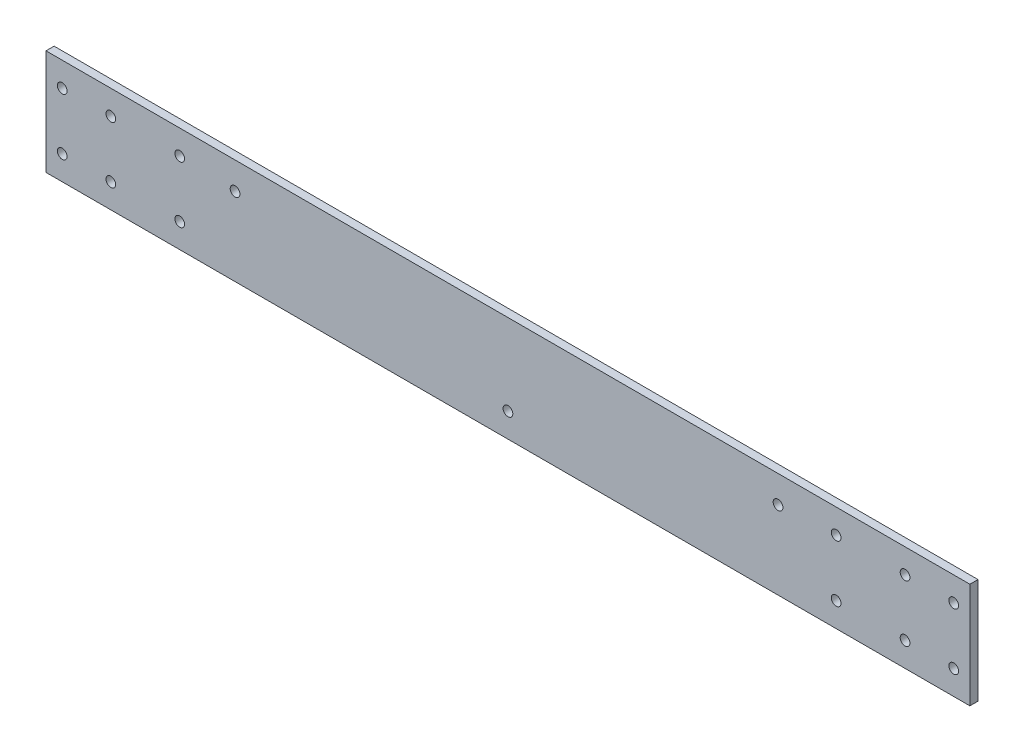
ISO-10303-21;
HEADER;
FILE_DESCRIPTION(('STEP AP214'),'2;1');
FILE_NAME('part.step','',(''),(''),'','','');
FILE_SCHEMA(('AUTOMOTIVE_DESIGN { 1 0 10303 214 1 1 1 1 }'));
ENDSEC;
DATA;
#1=APPLICATION_CONTEXT('core data for automotive mechanical design processes');
#2=APPLICATION_PROTOCOL_DEFINITION('international standard','automotive_design',2000,#1);
#3=PRODUCT_CONTEXT('',#1,'mechanical');
#4=PRODUCT('Part','Part','',(#3));
#5=PRODUCT_RELATED_PRODUCT_CATEGORY('part','',(#4));
#6=PRODUCT_DEFINITION_FORMATION('','',#4);
#7=PRODUCT_DEFINITION_CONTEXT('part definition',#1,'design');
#8=PRODUCT_DEFINITION('design','',#6,#7);
#9=PRODUCT_DEFINITION_SHAPE('','',#8);
#10=(LENGTH_UNIT() NAMED_UNIT(*) SI_UNIT(.MILLI.,.METRE.));
#11=(NAMED_UNIT(*) PLANE_ANGLE_UNIT() SI_UNIT($,.RADIAN.));
#12=(NAMED_UNIT(*) SI_UNIT($,.STERADIAN.) SOLID_ANGLE_UNIT());
#13=UNCERTAINTY_MEASURE_WITH_UNIT(LENGTH_MEASURE(1.E-05),#10,'distance_accuracy_value','');
#14=(GEOMETRIC_REPRESENTATION_CONTEXT(3) GLOBAL_UNCERTAINTY_ASSIGNED_CONTEXT((#13)) GLOBAL_UNIT_ASSIGNED_CONTEXT((#10,
#11,#12)) REPRESENTATION_CONTEXT('',''));
#15=CARTESIAN_POINT('',(0.,0.,0.));
#16=DIRECTION('',(0.,0.,1.));
#17=DIRECTION('',(1.,0.,0.));
#18=AXIS2_PLACEMENT_3D('',#15,#16,#17);
#19=CARTESIAN_POINT('',(0.,0.,10.));
#20=DIRECTION('',(0.,0.,1.));
#21=DIRECTION('',(1.,0.,0.));
#22=AXIS2_PLACEMENT_3D('',#19,#20,#21);
#23=PLANE('',#22);
#24=CARTESIAN_POINT('',(-336.722006644744,31.4673024219252,10.));
#25=DIRECTION('',(0.,0.,1.));
#26=DIRECTION('',(1.,0.,0.));
#27=AXIS2_PLACEMENT_3D('',#24,#25,#26);
#28=CIRCLE('',#27,5.99999999999999);
#29=CARTESIAN_POINT('',(-330.722006644744,31.4673024219252,10.));
#30=VERTEX_POINT('',#29);
#31=EDGE_CURVE('E201',#30,#30,#28,.T.);
#32=ORIENTED_EDGE('',*,*,#31,.F.);
#33=EDGE_LOOP('',(#32));
#34=FACE_BOUND('',#33,.T.);
#35=CARTESIAN_POINT('',(333.277993355256,31.4673024219252,10.));
#36=DIRECTION('',(0.,0.,1.));
#37=DIRECTION('',(1.,0.,0.));
#38=AXIS2_PLACEMENT_3D('',#35,#36,#37);
#39=CIRCLE('',#38,5.99999999999999);
#40=CARTESIAN_POINT('',(339.277993355256,31.4673024219252,10.));
#41=VERTEX_POINT('',#40);
#42=EDGE_CURVE('E195',#41,#41,#39,.T.);
#43=ORIENTED_EDGE('',*,*,#42,.F.);
#44=EDGE_LOOP('',(#43));
#45=FACE_BOUND('',#44,.T.);
#46=CARTESIAN_POINT('',(8.96227536628658E-12,-35.0000000000066,10.));
#47=DIRECTION('',(0.,0.,1.));
#48=DIRECTION('',(1.,0.,0.));
#49=AXIS2_PLACEMENT_3D('',#46,#47,#48);
#50=CIRCLE('',#49,6.);
#51=CARTESIAN_POINT('',(6.00000000000896,-35.0000000000066,10.));
#52=VERTEX_POINT('',#51);
#53=EDGE_CURVE('E189',#52,#52,#50,.T.);
#54=ORIENTED_EDGE('',*,*,#53,.F.);
#55=EDGE_LOOP('',(#54));
#56=FACE_BOUND('',#55,.T.);
#57=CARTESIAN_POINT('',(490.,35.0000000000001,10.));
#58=DIRECTION('',(0.,0.,1.));
#59=DIRECTION('',(-1.,0.,0.));
#60=AXIS2_PLACEMENT_3D('',#57,#58,#59);
#61=CIRCLE('',#60,5.99999999999999);
#62=CARTESIAN_POINT('',(484.,35.0000000000001,10.));
#63=VERTEX_POINT('',#62);
#64=EDGE_CURVE('E174',#63,#63,#61,.T.);
#65=ORIENTED_EDGE('',*,*,#64,.F.);
#66=EDGE_LOOP('',(#65));
#67=FACE_BOUND('',#66,.T.);
#68=CARTESIAN_POINT('',(550.,-34.9999999999999,10.));
#69=DIRECTION('',(0.,0.,1.));
#70=DIRECTION('',(-1.,0.,0.));
#71=AXIS2_PLACEMENT_3D('',#68,#69,#70);
#72=CIRCLE('',#71,5.99999999999999);
#73=CARTESIAN_POINT('',(544.,-34.9999999999999,10.));
#74=VERTEX_POINT('',#73);
#75=EDGE_CURVE('E162',#74,#74,#72,.T.);
#76=ORIENTED_EDGE('',*,*,#75,.F.);
#77=EDGE_LOOP('',(#76));
#78=FACE_BOUND('',#77,.T.);
#79=CARTESIAN_POINT('',(405.,-35.,10.));
#80=DIRECTION('',(0.,0.,1.));
#81=DIRECTION('',(-1.,0.,0.));
#82=AXIS2_PLACEMENT_3D('',#79,#80,#81);
#83=CIRCLE('',#82,6.00000000000005);
#84=CARTESIAN_POINT('',(399.,-35.,10.));
#85=VERTEX_POINT('',#84);
#86=EDGE_CURVE('E150',#85,#85,#83,.T.);
#87=ORIENTED_EDGE('',*,*,#86,.F.);
#88=EDGE_LOOP('',(#87));
#89=FACE_BOUND('',#88,.T.);
#90=CARTESIAN_POINT('',(-490.,-35.0000000000001,10.));
#91=DIRECTION('',(0.,0.,1.));
#92=DIRECTION('',(1.,0.,0.));
#93=AXIS2_PLACEMENT_3D('',#90,#91,#92);
#94=CIRCLE('',#93,5.99999999999999);
#95=CARTESIAN_POINT('',(-484.,-35.0000000000001,10.));
#96=VERTEX_POINT('',#95);
#97=EDGE_CURVE('E138',#96,#96,#94,.T.);
#98=ORIENTED_EDGE('',*,*,#97,.F.);
#99=EDGE_LOOP('',(#98));
#100=FACE_BOUND('',#99,.T.);
#101=CARTESIAN_POINT('',(-405.,35.,10.));
#102=DIRECTION('',(0.,0.,1.));
#103=DIRECTION('',(1.,0.,0.));
#104=AXIS2_PLACEMENT_3D('',#101,#102,#103);
#105=CIRCLE('',#104,5.99999999999999);
#106=CARTESIAN_POINT('',(-399.,35.,10.));
#107=VERTEX_POINT('',#106);
#108=EDGE_CURVE('E126',#107,#107,#105,.T.);
#109=ORIENTED_EDGE('',*,*,#108,.F.);
#110=EDGE_LOOP('',(#109));
#111=FACE_BOUND('',#110,.T.);
#112=CARTESIAN_POINT('',(-550.,35.,10.));
#113=DIRECTION('',(0.,0.,1.));
#114=DIRECTION('',(1.,0.,0.));
#115=AXIS2_PLACEMENT_3D('',#112,#113,#114);
#116=CIRCLE('',#115,5.99999999999999);
#117=CARTESIAN_POINT('',(-544.,35.,10.));
#118=VERTEX_POINT('',#117);
#119=EDGE_CURVE('E105',#118,#118,#116,.T.);
#120=ORIENTED_EDGE('',*,*,#119,.F.);
#121=EDGE_LOOP('',(#120));
#122=FACE_BOUND('',#121,.T.);
#123=DIRECTION('',(0.,-1.,0.));
#124=VECTOR('',#123,1.);
#125=CARTESIAN_POINT('',(-570.,64.9999999999999,10.));
#126=LINE('',#125,#124);
#127=CARTESIAN_POINT('',(-570.,64.9999999999999,10.));
#128=VERTEX_POINT('',#127);
#129=CARTESIAN_POINT('',(-570.,-65.0000000000001,10.));
#130=VERTEX_POINT('',#129);
#131=EDGE_CURVE('E90',#128,#130,#126,.T.);
#132=ORIENTED_EDGE('',*,*,#131,.T.);
#133=DIRECTION('',(1.,0.,0.));
#134=VECTOR('',#133,1.);
#135=CARTESIAN_POINT('',(-570.,-65.0000000000001,10.));
#136=LINE('',#135,#134);
#137=CARTESIAN_POINT('',(570.,-65.,10.));
#138=VERTEX_POINT('',#137);
#139=EDGE_CURVE('E85',#130,#138,#136,.T.);
#140=ORIENTED_EDGE('',*,*,#139,.T.);
#141=DIRECTION('',(0.,1.,0.));
#142=VECTOR('',#141,1.);
#143=CARTESIAN_POINT('',(570.,65.,10.));
#144=LINE('',#143,#142);
#145=CARTESIAN_POINT('',(570.,65.,10.));
#146=VERTEX_POINT('',#145);
#147=EDGE_CURVE('E88',#138,#146,#144,.T.);
#148=ORIENTED_EDGE('',*,*,#147,.T.);
#149=DIRECTION('',(-1.,0.,0.));
#150=VECTOR('',#149,1.);
#151=CARTESIAN_POINT('',(-570.,64.9999999999999,10.));
#152=LINE('',#151,#150);
#153=EDGE_CURVE('E55',#146,#128,#152,.T.);
#154=ORIENTED_EDGE('',*,*,#153,.T.);
#155=EDGE_LOOP('',(#132,#140,#148,#154));
#156=FACE_BOUND('',#155,.T.);
#157=CARTESIAN_POINT('',(-490.,35.,10.));
#158=DIRECTION('',(0.,0.,1.));
#159=DIRECTION('',(1.,0.,0.));
#160=AXIS2_PLACEMENT_3D('',#157,#158,#159);
#161=CIRCLE('',#160,5.99999999999999);
#162=CARTESIAN_POINT('',(-484.,35.,10.));
#163=VERTEX_POINT('',#162);
#164=EDGE_CURVE('E120',#163,#163,#161,.T.);
#165=ORIENTED_EDGE('',*,*,#164,.F.);
#166=EDGE_LOOP('',(#165));
#167=FACE_BOUND('',#166,.T.);
#168=CARTESIAN_POINT('',(-550.,-35.0000000000001,10.));
#169=DIRECTION('',(0.,0.,1.));
#170=DIRECTION('',(1.,0.,0.));
#171=AXIS2_PLACEMENT_3D('',#168,#169,#170);
#172=CIRCLE('',#171,5.99999999999999);
#173=CARTESIAN_POINT('',(-544.,-35.0000000000001,10.));
#174=VERTEX_POINT('',#173);
#175=EDGE_CURVE('E132',#174,#174,#172,.T.);
#176=ORIENTED_EDGE('',*,*,#175,.F.);
#177=EDGE_LOOP('',(#176));
#178=FACE_BOUND('',#177,.T.);
#179=CARTESIAN_POINT('',(-405.,-35.0000000000001,10.));
#180=DIRECTION('',(0.,0.,1.));
#181=DIRECTION('',(1.,0.,0.));
#182=AXIS2_PLACEMENT_3D('',#179,#180,#181);
#183=CIRCLE('',#182,5.99999999999999);
#184=CARTESIAN_POINT('',(-399.,-35.0000000000001,10.));
#185=VERTEX_POINT('',#184);
#186=EDGE_CURVE('E144',#185,#185,#183,.T.);
#187=ORIENTED_EDGE('',*,*,#186,.F.);
#188=EDGE_LOOP('',(#187));
#189=FACE_BOUND('',#188,.T.);
#190=CARTESIAN_POINT('',(490.,-34.9999999999999,10.));
#191=DIRECTION('',(0.,0.,1.));
#192=DIRECTION('',(-1.,0.,0.));
#193=AXIS2_PLACEMENT_3D('',#190,#191,#192);
#194=CIRCLE('',#193,5.99999999999999);
#195=CARTESIAN_POINT('',(484.,-34.9999999999999,10.));
#196=VERTEX_POINT('',#195);
#197=EDGE_CURVE('E156',#196,#196,#194,.T.);
#198=ORIENTED_EDGE('',*,*,#197,.F.);
#199=EDGE_LOOP('',(#198));
#200=FACE_BOUND('',#199,.T.);
#201=CARTESIAN_POINT('',(405.,35.,10.));
#202=DIRECTION('',(0.,0.,1.));
#203=DIRECTION('',(-1.,0.,0.));
#204=AXIS2_PLACEMENT_3D('',#201,#202,#203);
#205=CIRCLE('',#204,6.00000000000005);
#206=CARTESIAN_POINT('',(399.,35.,10.));
#207=VERTEX_POINT('',#206);
#208=EDGE_CURVE('E168',#207,#207,#205,.T.);
#209=ORIENTED_EDGE('',*,*,#208,.F.);
#210=EDGE_LOOP('',(#209));
#211=FACE_BOUND('',#210,.T.);
#212=CARTESIAN_POINT('',(550.,35.0000000000001,10.));
#213=DIRECTION('',(0.,0.,1.));
#214=DIRECTION('',(-1.,0.,0.));
#215=AXIS2_PLACEMENT_3D('',#212,#213,#214);
#216=CIRCLE('',#215,5.99999999999999);
#217=CARTESIAN_POINT('',(544.,35.0000000000001,10.));
#218=VERTEX_POINT('',#217);
#219=EDGE_CURVE('E180',#218,#218,#216,.T.);
#220=ORIENTED_EDGE('',*,*,#219,.F.);
#221=EDGE_LOOP('',(#220));
#222=FACE_BOUND('',#221,.T.);
#223=ADVANCED_FACE('F38',(#34,#45,#56,#67,#78,#89,#100,#111,#122,#156,#167,#178,#189,#200,#211,
#222),#23,.T.);
#224=CARTESIAN_POINT('',(0.,0.,0.));
#225=DIRECTION('',(0.,0.,1.));
#226=DIRECTION('',(1.,0.,0.));
#227=AXIS2_PLACEMENT_3D('',#224,#225,#226);
#228=PLANE('',#227);
#229=CARTESIAN_POINT('',(-336.722006644744,31.4673024219252,0.));
#230=DIRECTION('',(0.,0.,1.));
#231=DIRECTION('',(1.,0.,0.));
#232=AXIS2_PLACEMENT_3D('',#229,#230,#231);
#233=CIRCLE('',#232,5.99999999999999);
#234=CARTESIAN_POINT('',(-330.722006644744,31.4673024219252,0.));
#235=VERTEX_POINT('',#234);
#236=EDGE_CURVE('E198',#235,#235,#233,.T.);
#237=ORIENTED_EDGE('',*,*,#236,.T.);
#238=EDGE_LOOP('',(#237));
#239=FACE_BOUND('',#238,.T.);
#240=CARTESIAN_POINT('',(333.277993355256,31.4673024219252,0.));
#241=DIRECTION('',(0.,0.,1.));
#242=DIRECTION('',(1.,0.,0.));
#243=AXIS2_PLACEMENT_3D('',#240,#241,#242);
#244=CIRCLE('',#243,5.99999999999999);
#245=CARTESIAN_POINT('',(339.277993355256,31.4673024219252,0.));
#246=VERTEX_POINT('',#245);
#247=EDGE_CURVE('E192',#246,#246,#244,.T.);
#248=ORIENTED_EDGE('',*,*,#247,.T.);
#249=EDGE_LOOP('',(#248));
#250=FACE_BOUND('',#249,.T.);
#251=CARTESIAN_POINT('',(8.96227536628658E-12,-35.0000000000066,0.));
#252=DIRECTION('',(0.,0.,1.));
#253=DIRECTION('',(1.,0.,0.));
#254=AXIS2_PLACEMENT_3D('',#251,#252,#253);
#255=CIRCLE('',#254,6.);
#256=CARTESIAN_POINT('',(6.00000000000896,-35.0000000000066,0.));
#257=VERTEX_POINT('',#256);
#258=EDGE_CURVE('E186',#257,#257,#255,.T.);
#259=ORIENTED_EDGE('',*,*,#258,.T.);
#260=EDGE_LOOP('',(#259));
#261=FACE_BOUND('',#260,.T.);
#262=CARTESIAN_POINT('',(490.,35.0000000000001,0.));
#263=DIRECTION('',(0.,0.,1.));
#264=DIRECTION('',(-1.,0.,0.));
#265=AXIS2_PLACEMENT_3D('',#262,#263,#264);
#266=CIRCLE('',#265,5.99999999999999);
#267=CARTESIAN_POINT('',(484.,35.0000000000001,0.));
#268=VERTEX_POINT('',#267);
#269=EDGE_CURVE('E177',#268,#268,#266,.T.);
#270=ORIENTED_EDGE('',*,*,#269,.T.);
#271=EDGE_LOOP('',(#270));
#272=FACE_BOUND('',#271,.T.);
#273=CARTESIAN_POINT('',(550.,-34.9999999999999,0.));
#274=DIRECTION('',(0.,0.,1.));
#275=DIRECTION('',(-1.,0.,0.));
#276=AXIS2_PLACEMENT_3D('',#273,#274,#275);
#277=CIRCLE('',#276,5.99999999999999);
#278=CARTESIAN_POINT('',(544.,-34.9999999999999,0.));
#279=VERTEX_POINT('',#278);
#280=EDGE_CURVE('E165',#279,#279,#277,.T.);
#281=ORIENTED_EDGE('',*,*,#280,.T.);
#282=EDGE_LOOP('',(#281));
#283=FACE_BOUND('',#282,.T.);
#284=CARTESIAN_POINT('',(405.,-35.,0.));
#285=DIRECTION('',(0.,0.,1.));
#286=DIRECTION('',(-1.,0.,0.));
#287=AXIS2_PLACEMENT_3D('',#284,#285,#286);
#288=CIRCLE('',#287,6.00000000000005);
#289=CARTESIAN_POINT('',(399.,-35.,0.));
#290=VERTEX_POINT('',#289);
#291=EDGE_CURVE('E153',#290,#290,#288,.T.);
#292=ORIENTED_EDGE('',*,*,#291,.T.);
#293=EDGE_LOOP('',(#292));
#294=FACE_BOUND('',#293,.T.);
#295=CARTESIAN_POINT('',(-490.,-35.0000000000001,0.));
#296=DIRECTION('',(0.,0.,1.));
#297=DIRECTION('',(1.,0.,0.));
#298=AXIS2_PLACEMENT_3D('',#295,#296,#297);
#299=CIRCLE('',#298,5.99999999999999);
#300=CARTESIAN_POINT('',(-484.,-35.0000000000001,0.));
#301=VERTEX_POINT('',#300);
#302=EDGE_CURVE('E141',#301,#301,#299,.T.);
#303=ORIENTED_EDGE('',*,*,#302,.T.);
#304=EDGE_LOOP('',(#303));
#305=FACE_BOUND('',#304,.T.);
#306=CARTESIAN_POINT('',(-405.,35.,0.));
#307=DIRECTION('',(0.,0.,1.));
#308=DIRECTION('',(1.,0.,0.));
#309=AXIS2_PLACEMENT_3D('',#306,#307,#308);
#310=CIRCLE('',#309,5.99999999999999);
#311=CARTESIAN_POINT('',(-399.,35.,0.));
#312=VERTEX_POINT('',#311);
#313=EDGE_CURVE('E129',#312,#312,#310,.T.);
#314=ORIENTED_EDGE('',*,*,#313,.T.);
#315=EDGE_LOOP('',(#314));
#316=FACE_BOUND('',#315,.T.);
#317=CARTESIAN_POINT('',(-550.,35.,0.));
#318=DIRECTION('',(0.,0.,1.));
#319=DIRECTION('',(1.,0.,0.));
#320=AXIS2_PLACEMENT_3D('',#317,#318,#319);
#321=CIRCLE('',#320,5.99999999999999);
#322=CARTESIAN_POINT('',(-544.,35.,0.));
#323=VERTEX_POINT('',#322);
#324=EDGE_CURVE('E117',#323,#323,#321,.T.);
#325=ORIENTED_EDGE('',*,*,#324,.T.);
#326=EDGE_LOOP('',(#325));
#327=FACE_BOUND('',#326,.T.);
#328=DIRECTION('',(0.,-1.,0.));
#329=VECTOR('',#328,1.);
#330=CARTESIAN_POINT('',(-570.,64.9999999999999,0.));
#331=LINE('',#330,#329);
#332=CARTESIAN_POINT('',(-570.,64.9999999999999,0.));
#333=VERTEX_POINT('',#332);
#334=CARTESIAN_POINT('',(-570.,-65.0000000000001,0.));
#335=VERTEX_POINT('',#334);
#336=EDGE_CURVE('E102',#333,#335,#331,.T.);
#337=ORIENTED_EDGE('',*,*,#336,.F.);
#338=DIRECTION('',(-1.,0.,0.));
#339=VECTOR('',#338,1.);
#340=CARTESIAN_POINT('',(-570.,64.9999999999999,0.));
#341=LINE('',#340,#339);
#342=CARTESIAN_POINT('',(570.,65.,0.));
#343=VERTEX_POINT('',#342);
#344=EDGE_CURVE('E78',#343,#333,#341,.T.);
#345=ORIENTED_EDGE('',*,*,#344,.F.);
#346=DIRECTION('',(0.,1.,0.));
#347=VECTOR('',#346,1.);
#348=CARTESIAN_POINT('',(570.,65.,0.));
#349=LINE('',#348,#347);
#350=CARTESIAN_POINT('',(570.,-65.,0.));
#351=VERTEX_POINT('',#350);
#352=EDGE_CURVE('E72',#351,#343,#349,.T.);
#353=ORIENTED_EDGE('',*,*,#352,.F.);
#354=DIRECTION('',(1.,0.,0.));
#355=VECTOR('',#354,1.);
#356=CARTESIAN_POINT('',(-570.,-65.0000000000001,0.));
#357=LINE('',#356,#355);
#358=EDGE_CURVE('E94',#335,#351,#357,.T.);
#359=ORIENTED_EDGE('',*,*,#358,.F.);
#360=EDGE_LOOP('',(#337,#345,#353,#359));
#361=FACE_BOUND('',#360,.T.);
#362=CARTESIAN_POINT('',(-490.,35.,0.));
#363=DIRECTION('',(0.,0.,1.));
#364=DIRECTION('',(1.,0.,0.));
#365=AXIS2_PLACEMENT_3D('',#362,#363,#364);
#366=CIRCLE('',#365,5.99999999999999);
#367=CARTESIAN_POINT('',(-484.,35.,0.));
#368=VERTEX_POINT('',#367);
#369=EDGE_CURVE('E123',#368,#368,#366,.T.);
#370=ORIENTED_EDGE('',*,*,#369,.T.);
#371=EDGE_LOOP('',(#370));
#372=FACE_BOUND('',#371,.T.);
#373=CARTESIAN_POINT('',(-550.,-35.0000000000001,0.));
#374=DIRECTION('',(0.,0.,1.));
#375=DIRECTION('',(1.,0.,0.));
#376=AXIS2_PLACEMENT_3D('',#373,#374,#375);
#377=CIRCLE('',#376,5.99999999999999);
#378=CARTESIAN_POINT('',(-544.,-35.0000000000001,0.));
#379=VERTEX_POINT('',#378);
#380=EDGE_CURVE('E135',#379,#379,#377,.T.);
#381=ORIENTED_EDGE('',*,*,#380,.T.);
#382=EDGE_LOOP('',(#381));
#383=FACE_BOUND('',#382,.T.);
#384=CARTESIAN_POINT('',(-405.,-35.0000000000001,0.));
#385=DIRECTION('',(0.,0.,1.));
#386=DIRECTION('',(1.,0.,0.));
#387=AXIS2_PLACEMENT_3D('',#384,#385,#386);
#388=CIRCLE('',#387,5.99999999999999);
#389=CARTESIAN_POINT('',(-399.,-35.0000000000001,0.));
#390=VERTEX_POINT('',#389);
#391=EDGE_CURVE('E147',#390,#390,#388,.T.);
#392=ORIENTED_EDGE('',*,*,#391,.T.);
#393=EDGE_LOOP('',(#392));
#394=FACE_BOUND('',#393,.T.);
#395=CARTESIAN_POINT('',(490.,-34.9999999999999,0.));
#396=DIRECTION('',(0.,0.,1.));
#397=DIRECTION('',(-1.,0.,0.));
#398=AXIS2_PLACEMENT_3D('',#395,#396,#397);
#399=CIRCLE('',#398,5.99999999999999);
#400=CARTESIAN_POINT('',(484.,-34.9999999999999,0.));
#401=VERTEX_POINT('',#400);
#402=EDGE_CURVE('E159',#401,#401,#399,.T.);
#403=ORIENTED_EDGE('',*,*,#402,.T.);
#404=EDGE_LOOP('',(#403));
#405=FACE_BOUND('',#404,.T.);
#406=CARTESIAN_POINT('',(405.,35.,0.));
#407=DIRECTION('',(0.,0.,1.));
#408=DIRECTION('',(-1.,0.,0.));
#409=AXIS2_PLACEMENT_3D('',#406,#407,#408);
#410=CIRCLE('',#409,6.00000000000005);
#411=CARTESIAN_POINT('',(399.,35.,0.));
#412=VERTEX_POINT('',#411);
#413=EDGE_CURVE('E171',#412,#412,#410,.T.);
#414=ORIENTED_EDGE('',*,*,#413,.T.);
#415=EDGE_LOOP('',(#414));
#416=FACE_BOUND('',#415,.T.);
#417=CARTESIAN_POINT('',(550.,35.0000000000001,0.));
#418=DIRECTION('',(0.,0.,1.));
#419=DIRECTION('',(-1.,0.,0.));
#420=AXIS2_PLACEMENT_3D('',#417,#418,#419);
#421=CIRCLE('',#420,5.99999999999999);
#422=CARTESIAN_POINT('',(544.,35.0000000000001,0.));
#423=VERTEX_POINT('',#422);
#424=EDGE_CURVE('E183',#423,#423,#421,.T.);
#425=ORIENTED_EDGE('',*,*,#424,.T.);
#426=EDGE_LOOP('',(#425));
#427=FACE_BOUND('',#426,.T.);
#428=ADVANCED_FACE('F113',(#239,#250,#261,#272,#283,#294,#305,#316,#327,#361,#372,#383,#394,
#405,#416,#427),#228,.F.);
#429=CARTESIAN_POINT('',(-570.,64.9999999999999,10.));
#430=DIRECTION('',(1.,0.,0.));
#431=DIRECTION('',(0.,0.,-1.));
#432=AXIS2_PLACEMENT_3D('',#429,#430,#431);
#433=PLANE('',#432);
#434=ORIENTED_EDGE('',*,*,#336,.T.);
#435=DIRECTION('',(0.,0.,-1.));
#436=VECTOR('',#435,1.);
#437=CARTESIAN_POINT('',(-570.,-65.0000000000001,10.));
#438=LINE('',#437,#436);
#439=EDGE_CURVE('E11',#130,#335,#438,.T.);
#440=ORIENTED_EDGE('',*,*,#439,.F.);
#441=ORIENTED_EDGE('',*,*,#131,.F.);
#442=DIRECTION('',(0.,0.,-1.));
#443=VECTOR('',#442,1.);
#444=CARTESIAN_POINT('',(-570.,64.9999999999999,10.));
#445=LINE('',#444,#443);
#446=EDGE_CURVE('E98',#128,#333,#445,.T.);
#447=ORIENTED_EDGE('',*,*,#446,.T.);
#448=EDGE_LOOP('',(#434,#440,#441,#447));
#449=FACE_BOUND('',#448,.T.);
#450=ADVANCED_FACE('F40',(#449),#433,.F.);
#451=CARTESIAN_POINT('',(-570.,-65.0000000000001,10.));
#452=DIRECTION('',(0.,1.,0.));
#453=DIRECTION('',(-1.,0.,0.));
#454=AXIS2_PLACEMENT_3D('',#451,#452,#453);
#455=PLANE('',#454);
#456=ORIENTED_EDGE('',*,*,#358,.T.);
#457=DIRECTION('',(0.,0.,-1.));
#458=VECTOR('',#457,1.);
#459=CARTESIAN_POINT('',(570.,-65.,10.));
#460=LINE('',#459,#458);
#461=EDGE_CURVE('E47',#138,#351,#460,.T.);
#462=ORIENTED_EDGE('',*,*,#461,.F.);
#463=ORIENTED_EDGE('',*,*,#139,.F.);
#464=ORIENTED_EDGE('',*,*,#439,.T.);
#465=EDGE_LOOP('',(#456,#462,#463,#464));
#466=FACE_BOUND('',#465,.T.);
#467=ADVANCED_FACE('F93',(#466),#455,.F.);
#468=CARTESIAN_POINT('',(570.,65.,10.));
#469=DIRECTION('',(-1.,0.,0.));
#470=DIRECTION('',(0.,0.,1.));
#471=AXIS2_PLACEMENT_3D('',#468,#469,#470);
#472=PLANE('',#471);
#473=ORIENTED_EDGE('',*,*,#352,.T.);
#474=DIRECTION('',(0.,0.,-1.));
#475=VECTOR('',#474,1.);
#476=CARTESIAN_POINT('',(570.,65.,10.));
#477=LINE('',#476,#475);
#478=EDGE_CURVE('E95',#146,#343,#477,.T.);
#479=ORIENTED_EDGE('',*,*,#478,.F.);
#480=ORIENTED_EDGE('',*,*,#147,.F.);
#481=ORIENTED_EDGE('',*,*,#461,.T.);
#482=EDGE_LOOP('',(#473,#479,#480,#481));
#483=FACE_BOUND('',#482,.T.);
#484=ADVANCED_FACE('F96',(#483),#472,.F.);
#485=CARTESIAN_POINT('',(-570.,64.9999999999999,10.));
#486=DIRECTION('',(0.,-1.,0.));
#487=DIRECTION('',(1.,0.,0.));
#488=AXIS2_PLACEMENT_3D('',#485,#486,#487);
#489=PLANE('',#488);
#490=ORIENTED_EDGE('',*,*,#344,.T.);
#491=ORIENTED_EDGE('',*,*,#446,.F.);
#492=ORIENTED_EDGE('',*,*,#153,.F.);
#493=ORIENTED_EDGE('',*,*,#478,.T.);
#494=EDGE_LOOP('',(#490,#491,#492,#493));
#495=FACE_BOUND('',#494,.T.);
#496=ADVANCED_FACE('F110',(#495),#489,.F.);
#497=CARTESIAN_POINT('',(-550.,35.,10.));
#498=DIRECTION('',(0.,0.,-1.));
#499=DIRECTION('',(-1.,0.,0.));
#500=AXIS2_PLACEMENT_3D('',#497,#498,#499);
#501=CYLINDRICAL_SURFACE('',#500,5.99999999999999);
#502=ORIENTED_EDGE('',*,*,#119,.T.);
#503=EDGE_LOOP('',(#502));
#504=FACE_BOUND('',#503,.T.);
#505=ORIENTED_EDGE('',*,*,#324,.F.);
#506=EDGE_LOOP('',(#505));
#507=FACE_BOUND('',#506,.T.);
#508=ADVANCED_FACE('F235',(#504,#507),#501,.F.);
#509=CARTESIAN_POINT('',(-490.,35.,10.));
#510=DIRECTION('',(0.,0.,-1.));
#511=DIRECTION('',(-1.,0.,0.));
#512=AXIS2_PLACEMENT_3D('',#509,#510,#511);
#513=CYLINDRICAL_SURFACE('',#512,5.99999999999999);
#514=ORIENTED_EDGE('',*,*,#164,.T.);
#515=EDGE_LOOP('',(#514));
#516=FACE_BOUND('',#515,.T.);
#517=ORIENTED_EDGE('',*,*,#369,.F.);
#518=EDGE_LOOP('',(#517));
#519=FACE_BOUND('',#518,.T.);
#520=ADVANCED_FACE('F238',(#516,#519),#513,.F.);
#521=CARTESIAN_POINT('',(-405.,35.,10.));
#522=DIRECTION('',(0.,0.,-1.));
#523=DIRECTION('',(-1.,0.,0.));
#524=AXIS2_PLACEMENT_3D('',#521,#522,#523);
#525=CYLINDRICAL_SURFACE('',#524,5.99999999999999);
#526=ORIENTED_EDGE('',*,*,#108,.T.);
#527=EDGE_LOOP('',(#526));
#528=FACE_BOUND('',#527,.T.);
#529=ORIENTED_EDGE('',*,*,#313,.F.);
#530=EDGE_LOOP('',(#529));
#531=FACE_BOUND('',#530,.T.);
#532=ADVANCED_FACE('F274',(#528,#531),#525,.F.);
#533=CARTESIAN_POINT('',(-550.,-35.0000000000001,10.));
#534=DIRECTION('',(0.,0.,-1.));
#535=DIRECTION('',(-1.,0.,0.));
#536=AXIS2_PLACEMENT_3D('',#533,#534,#535);
#537=CYLINDRICAL_SURFACE('',#536,5.99999999999999);
#538=ORIENTED_EDGE('',*,*,#175,.T.);
#539=EDGE_LOOP('',(#538));
#540=FACE_BOUND('',#539,.T.);
#541=ORIENTED_EDGE('',*,*,#380,.F.);
#542=EDGE_LOOP('',(#541));
#543=FACE_BOUND('',#542,.T.);
#544=ADVANCED_FACE('F282',(#540,#543),#537,.F.);
#545=CARTESIAN_POINT('',(-490.,-35.0000000000001,10.));
#546=DIRECTION('',(0.,0.,-1.));
#547=DIRECTION('',(-1.,0.,0.));
#548=AXIS2_PLACEMENT_3D('',#545,#546,#547);
#549=CYLINDRICAL_SURFACE('',#548,5.99999999999999);
#550=ORIENTED_EDGE('',*,*,#97,.T.);
#551=EDGE_LOOP('',(#550));
#552=FACE_BOUND('',#551,.T.);
#553=ORIENTED_EDGE('',*,*,#302,.F.);
#554=EDGE_LOOP('',(#553));
#555=FACE_BOUND('',#554,.T.);
#556=ADVANCED_FACE('F290',(#552,#555),#549,.F.);
#557=CARTESIAN_POINT('',(-405.,-35.0000000000001,10.));
#558=DIRECTION('',(0.,0.,-1.));
#559=DIRECTION('',(-1.,0.,0.));
#560=AXIS2_PLACEMENT_3D('',#557,#558,#559);
#561=CYLINDRICAL_SURFACE('',#560,5.99999999999999);
#562=ORIENTED_EDGE('',*,*,#186,.T.);
#563=EDGE_LOOP('',(#562));
#564=FACE_BOUND('',#563,.T.);
#565=ORIENTED_EDGE('',*,*,#391,.F.);
#566=EDGE_LOOP('',(#565));
#567=FACE_BOUND('',#566,.T.);
#568=ADVANCED_FACE('F298',(#564,#567),#561,.F.);
#569=CARTESIAN_POINT('',(405.,-35.,10.));
#570=DIRECTION('',(0.,0.,-1.));
#571=DIRECTION('',(-1.,0.,0.));
#572=AXIS2_PLACEMENT_3D('',#569,#570,#571);
#573=CYLINDRICAL_SURFACE('',#572,6.00000000000005);
#574=ORIENTED_EDGE('',*,*,#86,.T.);
#575=EDGE_LOOP('',(#574));
#576=FACE_BOUND('',#575,.T.);
#577=ORIENTED_EDGE('',*,*,#291,.F.);
#578=EDGE_LOOP('',(#577));
#579=FACE_BOUND('',#578,.T.);
#580=ADVANCED_FACE('F306',(#576,#579),#573,.F.);
#581=CARTESIAN_POINT('',(490.,-34.9999999999999,10.));
#582=DIRECTION('',(0.,0.,-1.));
#583=DIRECTION('',(-1.,0.,0.));
#584=AXIS2_PLACEMENT_3D('',#581,#582,#583);
#585=CYLINDRICAL_SURFACE('',#584,5.99999999999999);
#586=ORIENTED_EDGE('',*,*,#197,.T.);
#587=EDGE_LOOP('',(#586));
#588=FACE_BOUND('',#587,.T.);
#589=ORIENTED_EDGE('',*,*,#402,.F.);
#590=EDGE_LOOP('',(#589));
#591=FACE_BOUND('',#590,.T.);
#592=ADVANCED_FACE('F314',(#588,#591),#585,.F.);
#593=CARTESIAN_POINT('',(550.,-34.9999999999999,10.));
#594=DIRECTION('',(0.,0.,-1.));
#595=DIRECTION('',(-1.,0.,0.));
#596=AXIS2_PLACEMENT_3D('',#593,#594,#595);
#597=CYLINDRICAL_SURFACE('',#596,5.99999999999999);
#598=ORIENTED_EDGE('',*,*,#75,.T.);
#599=EDGE_LOOP('',(#598));
#600=FACE_BOUND('',#599,.T.);
#601=ORIENTED_EDGE('',*,*,#280,.F.);
#602=EDGE_LOOP('',(#601));
#603=FACE_BOUND('',#602,.T.);
#604=ADVANCED_FACE('F322',(#600,#603),#597,.F.);
#605=CARTESIAN_POINT('',(405.,35.,10.));
#606=DIRECTION('',(0.,0.,-1.));
#607=DIRECTION('',(-1.,0.,0.));
#608=AXIS2_PLACEMENT_3D('',#605,#606,#607);
#609=CYLINDRICAL_SURFACE('',#608,6.00000000000005);
#610=ORIENTED_EDGE('',*,*,#208,.T.);
#611=EDGE_LOOP('',(#610));
#612=FACE_BOUND('',#611,.T.);
#613=ORIENTED_EDGE('',*,*,#413,.F.);
#614=EDGE_LOOP('',(#613));
#615=FACE_BOUND('',#614,.T.);
#616=ADVANCED_FACE('F330',(#612,#615),#609,.F.);
#617=CARTESIAN_POINT('',(490.,35.0000000000001,10.));
#618=DIRECTION('',(0.,0.,-1.));
#619=DIRECTION('',(-1.,0.,0.));
#620=AXIS2_PLACEMENT_3D('',#617,#618,#619);
#621=CYLINDRICAL_SURFACE('',#620,5.99999999999999);
#622=ORIENTED_EDGE('',*,*,#64,.T.);
#623=EDGE_LOOP('',(#622));
#624=FACE_BOUND('',#623,.T.);
#625=ORIENTED_EDGE('',*,*,#269,.F.);
#626=EDGE_LOOP('',(#625));
#627=FACE_BOUND('',#626,.T.);
#628=ADVANCED_FACE('F338',(#624,#627),#621,.F.);
#629=CARTESIAN_POINT('',(550.,35.0000000000001,10.));
#630=DIRECTION('',(0.,0.,-1.));
#631=DIRECTION('',(-1.,0.,0.));
#632=AXIS2_PLACEMENT_3D('',#629,#630,#631);
#633=CYLINDRICAL_SURFACE('',#632,5.99999999999999);
#634=ORIENTED_EDGE('',*,*,#219,.T.);
#635=EDGE_LOOP('',(#634));
#636=FACE_BOUND('',#635,.T.);
#637=ORIENTED_EDGE('',*,*,#424,.F.);
#638=EDGE_LOOP('',(#637));
#639=FACE_BOUND('',#638,.T.);
#640=ADVANCED_FACE('F346',(#636,#639),#633,.F.);
#641=CARTESIAN_POINT('',(8.96227536628658E-12,-35.0000000000066,0.));
#642=DIRECTION('',(0.,0.,1.));
#643=DIRECTION('',(1.,0.,0.));
#644=AXIS2_PLACEMENT_3D('',#641,#642,#643);
#645=CYLINDRICAL_SURFACE('',#644,6.);
#646=ORIENTED_EDGE('',*,*,#258,.F.);
#647=EDGE_LOOP('',(#646));
#648=FACE_BOUND('',#647,.T.);
#649=ORIENTED_EDGE('',*,*,#53,.T.);
#650=EDGE_LOOP('',(#649));
#651=FACE_BOUND('',#650,.T.);
#652=ADVANCED_FACE('F354',(#648,#651),#645,.F.);
#653=CARTESIAN_POINT('',(333.277993355256,31.4673024219252,0.));
#654=DIRECTION('',(0.,0.,1.));
#655=DIRECTION('',(1.,0.,0.));
#656=AXIS2_PLACEMENT_3D('',#653,#654,#655);
#657=CYLINDRICAL_SURFACE('',#656,5.99999999999999);
#658=ORIENTED_EDGE('',*,*,#247,.F.);
#659=EDGE_LOOP('',(#658));
#660=FACE_BOUND('',#659,.T.);
#661=ORIENTED_EDGE('',*,*,#42,.T.);
#662=EDGE_LOOP('',(#661));
#663=FACE_BOUND('',#662,.T.);
#664=ADVANCED_FACE('F212',(#660,#663),#657,.F.);
#665=CARTESIAN_POINT('',(-336.722006644744,31.4673024219252,0.));
#666=DIRECTION('',(0.,0.,1.));
#667=DIRECTION('',(1.,0.,0.));
#668=AXIS2_PLACEMENT_3D('',#665,#666,#667);
#669=CYLINDRICAL_SURFACE('',#668,5.99999999999999);
#670=ORIENTED_EDGE('',*,*,#236,.F.);
#671=EDGE_LOOP('',(#670));
#672=FACE_BOUND('',#671,.T.);
#673=ORIENTED_EDGE('',*,*,#31,.T.);
#674=EDGE_LOOP('',(#673));
#675=FACE_BOUND('',#674,.T.);
#676=ADVANCED_FACE('F209',(#672,#675),#669,.F.);
#677=CLOSED_SHELL('',(#223,#428,#450,#467,#484,#496,#508,#520,#532,#544,#556,#568,#580,#592,
#604,#616,#628,#640,#652,#664,#676));
#678=MANIFOLD_SOLID_BREP('B2',#677);
#679=ADVANCED_BREP_SHAPE_REPRESENTATION('',(#18,#678),#14);
#680=SHAPE_DEFINITION_REPRESENTATION(#9,#679);
ENDSEC;
END-ISO-10303-21;
